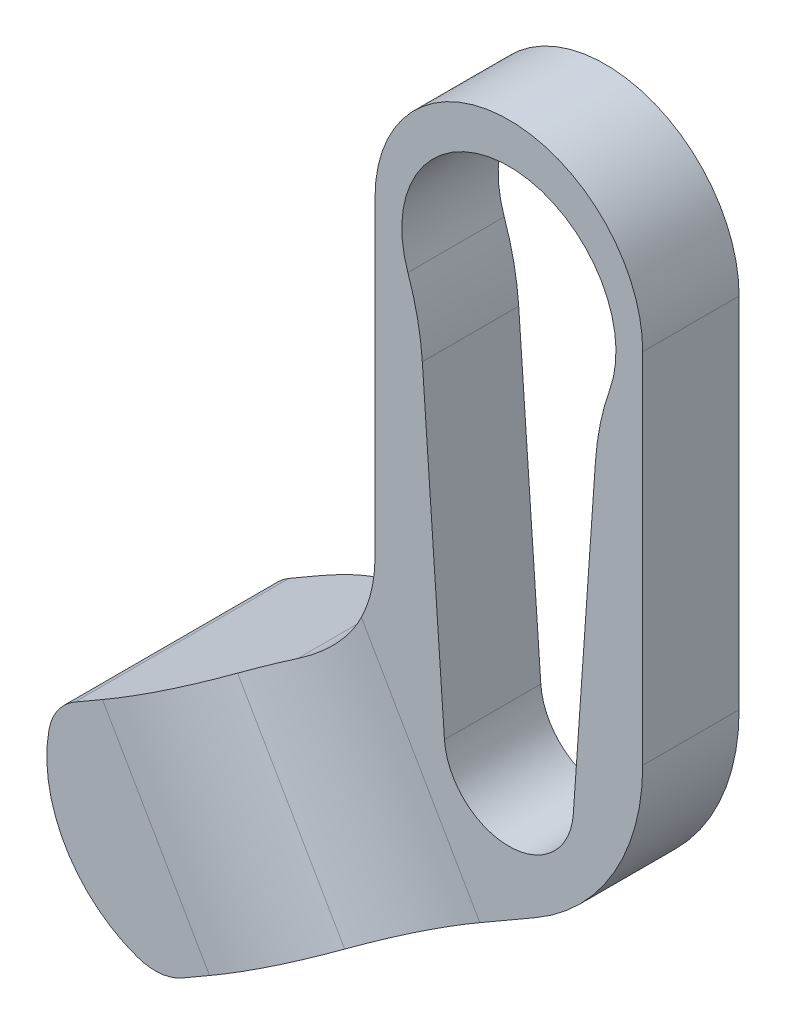
ISO-10303-21;
HEADER;
FILE_DESCRIPTION(('STEP AP214'),'2;1');
FILE_NAME('part.step','',(''),(''),'','','');
FILE_SCHEMA(('AUTOMOTIVE_DESIGN { 1 0 10303 214 1 1 1 1 }'));
ENDSEC;
DATA;
#1=APPLICATION_CONTEXT('core data for automotive mechanical design processes');
#2=APPLICATION_PROTOCOL_DEFINITION('international standard','automotive_design',2000,#1);
#3=PRODUCT_CONTEXT('',#1,'mechanical');
#4=PRODUCT('Part','Part','',(#3));
#5=PRODUCT_RELATED_PRODUCT_CATEGORY('part','',(#4));
#6=PRODUCT_DEFINITION_FORMATION('','',#4);
#7=PRODUCT_DEFINITION_CONTEXT('part definition',#1,'design');
#8=PRODUCT_DEFINITION('design','',#6,#7);
#9=PRODUCT_DEFINITION_SHAPE('','',#8);
#10=(LENGTH_UNIT() NAMED_UNIT(*) SI_UNIT(.MILLI.,.METRE.));
#11=(NAMED_UNIT(*) PLANE_ANGLE_UNIT() SI_UNIT($,.RADIAN.));
#12=(NAMED_UNIT(*) SI_UNIT($,.STERADIAN.) SOLID_ANGLE_UNIT());
#13=UNCERTAINTY_MEASURE_WITH_UNIT(LENGTH_MEASURE(1.E-05),#10,'distance_accuracy_value','');
#14=(GEOMETRIC_REPRESENTATION_CONTEXT(3) GLOBAL_UNCERTAINTY_ASSIGNED_CONTEXT((#13)) GLOBAL_UNIT_ASSIGNED_CONTEXT((#10,
#11,#12)) REPRESENTATION_CONTEXT('',''));
#15=CARTESIAN_POINT('',(0.,0.,0.));
#16=DIRECTION('',(0.,0.,1.));
#17=DIRECTION('',(1.,0.,0.));
#18=AXIS2_PLACEMENT_3D('',#15,#16,#17);
#19=CARTESIAN_POINT('',(-18.7542685333123,32.483345958487,4.));
#20=DIRECTION('',(0.500000000000002,-0.866025403784438,0.));
#21=DIRECTION('',(0.866025403784437,0.500000000000002,0.));
#22=AXIS2_PLACEMENT_3D('',#19,#20,#21);
#23=PLANE('',#22);
#24=DIRECTION('',(-0.866025403784437,-0.500000000000002,0.));
#25=VECTOR('',#24,1.);
#26=CARTESIAN_POINT('',(-18.7542685333123,32.483345958487,-4.));
#27=LINE('',#26,#25);
#28=CARTESIAN_POINT('',(-40.1409501060127,20.1357395954156,-4.));
#29=VERTEX_POINT('',#28);
#30=CARTESIAN_POINT('',(-41.1701576054595,19.541526368558,-4.));
#31=VERTEX_POINT('',#30);
#32=EDGE_CURVE('E435',#29,#31,#27,.T.);
#33=ORIENTED_EDGE('',*,*,#32,.F.);
#34=CARTESIAN_POINT('',(-40.1409501060127,20.1357395954156,6.));
#35=DIRECTION('',(0.500000000000002,-0.866025403784438,0.));
#36=DIRECTION('',(0.866025403784437,0.500000000000002,0.));
#37=AXIS2_PLACEMENT_3D('',#34,#35,#36);
#38=CIRCLE('',#37,10.);
#39=CARTESIAN_POINT('',(-36.1922161316863,22.4155422184512,-2.9));
#40=VERTEX_POINT('',#39);
#41=EDGE_CURVE('E255',#29,#40,#38,.T.);
#42=ORIENTED_EDGE('',*,*,#41,.T.);
#43=CARTESIAN_POINT('',(-32.2434821573598,24.6953448414868,-11.8));
#44=DIRECTION('',(0.500000000000002,-0.866025403784438,0.));
#45=DIRECTION('',(0.866025403784437,0.500000000000002,0.));
#46=AXIS2_PLACEMENT_3D('',#43,#44,#45);
#47=CIRCLE('',#46,10.);
#48=CARTESIAN_POINT('',(-32.2434821573598,24.6953448414868,-1.8));
#49=VERTEX_POINT('',#48);
#50=EDGE_CURVE('E271',#40,#49,#47,.F.);
#51=ORIENTED_EDGE('',*,*,#50,.T.);
#52=DIRECTION('',(0.866025403784437,0.500000000000002,0.));
#53=VECTOR('',#52,1.);
#54=CARTESIAN_POINT('',(-18.7542685333123,32.483345958487,-1.8));
#55=LINE('',#54,#53);
#56=CARTESIAN_POINT('',(-30.1595216539752,25.8985199990964,-1.8));
#57=VERTEX_POINT('',#56);
#58=EDGE_CURVE('E409',#49,#57,#55,.T.);
#59=ORIENTED_EDGE('',*,*,#58,.T.);
#60=DIRECTION('',(0.,0.,-1.));
#61=VECTOR('',#60,1.);
#62=CARTESIAN_POINT('',(-30.1595216539752,25.8985199990964,4.));
#63=LINE('',#62,#61);
#64=CARTESIAN_POINT('',(-30.1595216539752,25.8985199990964,1.8));
#65=VERTEX_POINT('',#64);
#66=EDGE_CURVE('E359',#57,#65,#63,.F.);
#67=ORIENTED_EDGE('',*,*,#66,.T.);
#68=DIRECTION('',(0.866025403784437,0.500000000000002,0.));
#69=VECTOR('',#68,1.);
#70=CARTESIAN_POINT('',(-18.7542685333123,32.483345958487,1.8));
#71=LINE('',#70,#69);
#72=CARTESIAN_POINT('',(-32.2434821573598,24.6953448414868,1.8));
#73=VERTEX_POINT('',#72);
#74=EDGE_CURVE('E474',#73,#65,#71,.T.);
#75=ORIENTED_EDGE('',*,*,#74,.F.);
#76=CARTESIAN_POINT('',(-32.2434821573598,24.6953448414868,11.8));
#77=DIRECTION('',(0.500000000000002,-0.866025403784438,0.));
#78=DIRECTION('',(0.866025403784437,0.500000000000002,0.));
#79=AXIS2_PLACEMENT_3D('',#76,#77,#78);
#80=CIRCLE('',#79,10.);
#81=CARTESIAN_POINT('',(-36.1922161316863,22.4155422184512,2.9));
#82=VERTEX_POINT('',#81);
#83=EDGE_CURVE('E509',#73,#82,#80,.F.);
#84=ORIENTED_EDGE('',*,*,#83,.T.);
#85=CARTESIAN_POINT('',(-40.1409501060127,20.1357395954156,-6.));
#86=DIRECTION('',(0.500000000000002,-0.866025403784438,0.));
#87=DIRECTION('',(0.866025403784437,0.500000000000002,0.));
#88=AXIS2_PLACEMENT_3D('',#85,#86,#87);
#89=CIRCLE('',#88,10.);
#90=CARTESIAN_POINT('',(-40.1409501060127,20.1357395954156,4.));
#91=VERTEX_POINT('',#90);
#92=EDGE_CURVE('E253',#82,#91,#89,.T.);
#93=ORIENTED_EDGE('',*,*,#92,.T.);
#94=DIRECTION('',(-0.866025403784437,-0.500000000000002,0.));
#95=VECTOR('',#94,1.);
#96=CARTESIAN_POINT('',(-18.7542685333123,32.483345958487,4.));
#97=LINE('',#96,#95);
#98=CARTESIAN_POINT('',(-41.1701576054595,19.541526368558,4.));
#99=VERTEX_POINT('',#98);
#100=EDGE_CURVE('E421',#91,#99,#97,.T.);
#101=ORIENTED_EDGE('',*,*,#100,.T.);
#102=DIRECTION('',(0.,0.,-1.));
#103=VECTOR('',#102,1.);
#104=CARTESIAN_POINT('',(-41.1701576054595,19.541526368558,4.));
#105=LINE('',#104,#103);
#106=EDGE_CURVE('E447',#99,#31,#105,.T.);
#107=ORIENTED_EDGE('',*,*,#106,.T.);
#108=EDGE_LOOP('',(#33,#42,#51,#59,#67,#75,#84,#93,#101,#107));
#109=FACE_BOUND('',#108,.T.);
#110=ADVANCED_FACE('F64',(#109),#23,.T.);
#111=CARTESIAN_POINT('',(-26.1595216539752,0.,4.));
#112=DIRECTION('',(1.,0.,0.));
#113=DIRECTION('',(0.,1.,0.));
#114=AXIS2_PLACEMENT_3D('',#111,#112,#113);
#115=PLANE('',#114);
#116=DIRECTION('',(0.,0.,-1.));
#117=VECTOR('',#116,1.);
#118=CARTESIAN_POINT('',(-26.1595216539752,32.8267232293719,4.));
#119=LINE('',#118,#117);
#120=CARTESIAN_POINT('',(-26.1595216539752,32.8267232293719,1.8));
#121=VERTEX_POINT('',#120);
#122=CARTESIAN_POINT('',(-26.1595216539752,32.8267232293719,-1.8));
#123=VERTEX_POINT('',#122);
#124=EDGE_CURVE('E366',#121,#123,#119,.T.);
#125=ORIENTED_EDGE('',*,*,#124,.T.);
#126=DIRECTION('',(0.,1.,0.));
#127=VECTOR('',#126,1.);
#128=CARTESIAN_POINT('',(-26.1595216539752,0.,-1.80000000000001));
#129=LINE('',#128,#127);
#130=CARTESIAN_POINT('',(-26.1595216539752,46.2079210758549,-1.8));
#131=VERTEX_POINT('',#130);
#132=EDGE_CURVE('E405',#123,#131,#129,.T.);
#133=ORIENTED_EDGE('',*,*,#132,.T.);
#134=DIRECTION('',(0.,0.,-1.));
#135=VECTOR('',#134,1.);
#136=CARTESIAN_POINT('',(-26.1595216539752,46.2079210758549,4.));
#137=LINE('',#136,#135);
#138=CARTESIAN_POINT('',(-26.1595216539752,46.2079210758549,1.8));
#139=VERTEX_POINT('',#138);
#140=EDGE_CURVE('E444',#139,#131,#137,.T.);
#141=ORIENTED_EDGE('',*,*,#140,.F.);
#142=DIRECTION('',(0.,1.,0.));
#143=VECTOR('',#142,1.);
#144=CARTESIAN_POINT('',(-26.1595216539752,0.,1.79999999999999));
#145=LINE('',#144,#143);
#146=EDGE_CURVE('E471',#121,#139,#145,.T.);
#147=ORIENTED_EDGE('',*,*,#146,.F.);
#148=EDGE_LOOP('',(#125,#133,#141,#147));
#149=FACE_BOUND('',#148,.T.);
#150=ADVANCED_FACE('F315',(#149),#115,.T.);
#151=CARTESIAN_POINT('',(-31.1595216539752,46.2079210758549,4.));
#152=DIRECTION('',(0.,0.,-1.));
#153=DIRECTION('',(-1.,0.,0.));
#154=AXIS2_PLACEMENT_3D('',#151,#152,#153);
#155=CYLINDRICAL_SURFACE('',#154,5.);
#156=ORIENTED_EDGE('',*,*,#140,.T.);
#157=CARTESIAN_POINT('',(-31.1595216539752,46.2079210758549,-1.8));
#158=DIRECTION('',(0.,0.,-1.));
#159=DIRECTION('',(0.,1.,0.));
#160=AXIS2_PLACEMENT_3D('',#157,#158,#159);
#161=CIRCLE('',#160,5.);
#162=CARTESIAN_POINT('',(-36.1595216539752,46.2079210758549,-1.8));
#163=VERTEX_POINT('',#162);
#164=EDGE_CURVE('E402',#131,#163,#161,.F.);
#165=ORIENTED_EDGE('',*,*,#164,.T.);
#166=DIRECTION('',(0.,0.,-1.));
#167=VECTOR('',#166,1.);
#168=CARTESIAN_POINT('',(-36.1595216539752,46.2079210758549,4.));
#169=LINE('',#168,#167);
#170=CARTESIAN_POINT('',(-36.1595216539752,46.2079210758549,1.8));
#171=VERTEX_POINT('',#170);
#172=EDGE_CURVE('E441',#171,#163,#169,.T.);
#173=ORIENTED_EDGE('',*,*,#172,.F.);
#174=CARTESIAN_POINT('',(-31.1595216539752,46.2079210758549,1.8));
#175=DIRECTION('',(0.,0.,-1.));
#176=DIRECTION('',(0.,1.,0.));
#177=AXIS2_PLACEMENT_3D('',#174,#175,#176);
#178=CIRCLE('',#177,5.);
#179=EDGE_CURVE('E469',#139,#171,#178,.F.);
#180=ORIENTED_EDGE('',*,*,#179,.F.);
#181=EDGE_LOOP('',(#156,#165,#173,#180));
#182=FACE_BOUND('',#181,.T.);
#183=ADVANCED_FACE('F321',(#182),#155,.T.);
#184=CARTESIAN_POINT('',(-36.1595216539752,0.,4.));
#185=DIRECTION('',(-1.,0.,0.));
#186=DIRECTION('',(0.,0.,1.));
#187=AXIS2_PLACEMENT_3D('',#184,#185,#186);
#188=PLANE('',#187);
#189=ORIENTED_EDGE('',*,*,#172,.T.);
#190=DIRECTION('',(0.,-1.,0.));
#191=VECTOR('',#190,1.);
#192=CARTESIAN_POINT('',(-36.1595216539752,0.,-1.80000000000001));
#193=LINE('',#192,#191);
#194=CARTESIAN_POINT('',(-36.1595216539752,34.5587740369408,-1.8));
#195=VERTEX_POINT('',#194);
#196=EDGE_CURVE('E399',#163,#195,#193,.T.);
#197=ORIENTED_EDGE('',*,*,#196,.T.);
#198=DIRECTION('',(0.,0.,-1.));
#199=VECTOR('',#198,1.);
#200=CARTESIAN_POINT('',(-36.1595216539752,34.5587740369408,4.));
#201=LINE('',#200,#199);
#202=CARTESIAN_POINT('',(-36.1595216539752,34.5587740369408,1.8));
#203=VERTEX_POINT('',#202);
#204=EDGE_CURVE('E368',#195,#203,#201,.F.);
#205=ORIENTED_EDGE('',*,*,#204,.T.);
#206=DIRECTION('',(0.,-1.,0.));
#207=VECTOR('',#206,1.);
#208=CARTESIAN_POINT('',(-36.1595216539752,0.,1.79999999999999));
#209=LINE('',#208,#207);
#210=EDGE_CURVE('E466',#171,#203,#209,.T.);
#211=ORIENTED_EDGE('',*,*,#210,.F.);
#212=EDGE_LOOP('',(#189,#197,#205,#211));
#213=FACE_BOUND('',#212,.T.);
#214=ADVANCED_FACE('F491',(#213),#188,.T.);
#215=CARTESIAN_POINT('',(-22.7542685333121,39.4115491887625,4.));
#216=DIRECTION('',(-0.499999999999997,0.86602540378444,0.));
#217=DIRECTION('',(-0.86602540378444,-0.499999999999997,0.));
#218=AXIS2_PLACEMENT_3D('',#215,#216,#217);
#219=PLANE('',#218);
#220=DIRECTION('',(0.,0.,-1.));
#221=VECTOR('',#220,1.);
#222=CARTESIAN_POINT('',(-38.6595216539753,30.2286470180186,-4.));
#223=LINE('',#222,#221);
#224=CARTESIAN_POINT('',(-38.6595216539753,30.2286470180186,2.19703149015583));
#225=VERTEX_POINT('',#224);
#226=CARTESIAN_POINT('',(-38.6595216539753,30.2286470180186,-2.19703149015583));
#227=VERTEX_POINT('',#226);
#228=EDGE_CURVE('E84',#225,#227,#223,.T.);
#229=ORIENTED_EDGE('',*,*,#228,.T.);
#230=CARTESIAN_POINT('',(-36.2434821573598,31.6235480717623,-11.8));
#231=DIRECTION('',(-0.499999999999997,0.86602540378444,0.));
#232=DIRECTION('',(-0.86602540378444,-0.499999999999997,0.));
#233=AXIS2_PLACEMENT_3D('',#230,#231,#232);
#234=CIRCLE('',#233,10.);
#235=CARTESIAN_POINT('',(-40.1922161316862,29.3437454487267,-2.9));
#236=VERTEX_POINT('',#235);
#237=EDGE_CURVE('E279',#227,#236,#234,.F.);
#238=ORIENTED_EDGE('',*,*,#237,.T.);
#239=CARTESIAN_POINT('',(-44.1409501060127,27.0639428256911,6.));
#240=DIRECTION('',(-0.499999999999997,0.86602540378444,0.));
#241=DIRECTION('',(-0.86602540378444,-0.499999999999997,0.));
#242=AXIS2_PLACEMENT_3D('',#239,#240,#241);
#243=CIRCLE('',#242,10.);
#244=CARTESIAN_POINT('',(-44.1409501060127,27.0639428256911,-4.));
#245=VERTEX_POINT('',#244);
#246=EDGE_CURVE('E249',#236,#245,#243,.T.);
#247=ORIENTED_EDGE('',*,*,#246,.T.);
#248=DIRECTION('',(0.86602540378444,0.499999999999997,0.));
#249=VECTOR('',#248,1.);
#250=CARTESIAN_POINT('',(-22.7542685333121,39.4115491887625,-4.));
#251=LINE('',#250,#249);
#252=CARTESIAN_POINT('',(-45.1701576054596,26.4697295988335,-4.));
#253=VERTEX_POINT('',#252);
#254=EDGE_CURVE('E416',#253,#245,#251,.T.);
#255=ORIENTED_EDGE('',*,*,#254,.F.);
#256=DIRECTION('',(0.,0.,-1.));
#257=VECTOR('',#256,1.);
#258=CARTESIAN_POINT('',(-45.1701576054596,26.4697295988335,4.));
#259=LINE('',#258,#257);
#260=CARTESIAN_POINT('',(-45.1701576054596,26.4697295988335,4.));
#261=VERTEX_POINT('',#260);
#262=EDGE_CURVE('E439',#261,#253,#259,.T.);
#263=ORIENTED_EDGE('',*,*,#262,.F.);
#264=DIRECTION('',(0.86602540378444,0.499999999999997,0.));
#265=VECTOR('',#264,1.);
#266=CARTESIAN_POINT('',(-22.7542685333121,39.4115491887625,4.));
#267=LINE('',#266,#265);
#268=CARTESIAN_POINT('',(-44.1409501060127,27.0639428256911,4.));
#269=VERTEX_POINT('',#268);
#270=EDGE_CURVE('E423',#261,#269,#267,.T.);
#271=ORIENTED_EDGE('',*,*,#270,.T.);
#272=CARTESIAN_POINT('',(-44.1409501060127,27.0639428256911,-6.));
#273=DIRECTION('',(-0.499999999999997,0.86602540378444,0.));
#274=DIRECTION('',(-0.86602540378444,-0.499999999999997,0.));
#275=AXIS2_PLACEMENT_3D('',#272,#273,#274);
#276=CIRCLE('',#275,10.);
#277=CARTESIAN_POINT('',(-40.1922161316862,29.3437454487267,2.9));
#278=VERTEX_POINT('',#277);
#279=EDGE_CURVE('E246',#269,#278,#276,.T.);
#280=ORIENTED_EDGE('',*,*,#279,.T.);
#281=CARTESIAN_POINT('',(-36.2434821573598,31.6235480717623,11.8));
#282=DIRECTION('',(-0.499999999999997,0.86602540378444,0.));
#283=DIRECTION('',(-0.86602540378444,-0.499999999999997,0.));
#284=AXIS2_PLACEMENT_3D('',#281,#282,#283);
#285=CIRCLE('',#284,10.);
#286=EDGE_CURVE('E78',#278,#225,#285,.F.);
#287=ORIENTED_EDGE('',*,*,#286,.T.);
#288=EDGE_LOOP('',(#229,#238,#247,#255,#263,#271,#280,#287));
#289=FACE_BOUND('',#288,.T.);
#290=ADVANCED_FACE('F486',(#289),#219,.T.);
#291=CARTESIAN_POINT('',(0.,0.,4.));
#292=DIRECTION('',(0.,0.,1.));
#293=DIRECTION('',(1.,0.,0.));
#294=AXIS2_PLACEMENT_3D('',#291,#292,#293);
#295=PLANE('',#294);
#296=ORIENTED_EDGE('',*,*,#100,.F.);
#297=DIRECTION('',(0.499999999999998,-0.86602540378444,0.));
#298=VECTOR('',#297,1.);
#299=CARTESIAN_POINT('',(-44.1409501060127,27.0639428256911,4.));
#300=LINE('',#299,#298);
#301=EDGE_CURVE('E258',#91,#269,#300,.F.);
#302=ORIENTED_EDGE('',*,*,#301,.T.);
#303=ORIENTED_EDGE('',*,*,#270,.F.);
#304=CARTESIAN_POINT('',(-44.1701576054596,24.7376787912646,4.));
#305=DIRECTION('',(0.,0.,1.));
#306=DIRECTION('',(1.,0.,0.));
#307=AXIS2_PLACEMENT_3D('',#304,#305,#306);
#308=CIRCLE('',#307,2.00000000000002);
#309=CARTESIAN_POINT('',(-46.1377451549108,25.0962861465219,4.));
#310=VERTEX_POINT('',#309);
#311=EDGE_CURVE('E412',#261,#310,#308,.T.);
#312=ORIENTED_EDGE('',*,*,#311,.T.);
#313=CARTESIAN_POINT('',(-41.129902450446,24.1835698466584,4.));
#314=DIRECTION('',(0.,0.,1.));
#315=DIRECTION('',(1.,0.,0.));
#316=AXIS2_PLACEMENT_3D('',#313,#314,#315);
#317=CIRCLE('',#316,5.09033786665463);
#318=CARTESIAN_POINT('',(-42.8433883005482,19.3902926965034,4.));
#319=VERTEX_POINT('',#318);
#320=EDGE_CURVE('E415',#310,#319,#317,.T.);
#321=ORIENTED_EDGE('',*,*,#320,.T.);
#322=CARTESIAN_POINT('',(-42.1701576054595,21.2735771761268,4.));
#323=DIRECTION('',(0.,0.,1.));
#324=DIRECTION('',(1.,0.,0.));
#325=AXIS2_PLACEMENT_3D('',#322,#323,#324);
#326=CIRCLE('',#325,2.);
#327=EDGE_CURVE('E418',#99,#319,#326,.F.);
#328=ORIENTED_EDGE('',*,*,#327,.F.);
#329=EDGE_LOOP('',(#296,#302,#303,#312,#321,#328));
#330=FACE_BOUND('',#329,.T.);
#331=ADVANCED_FACE('F352',(#330),#295,.T.);
#332=CARTESIAN_POINT('',(0.,0.,-4.));
#333=DIRECTION('',(0.,0.,1.));
#334=DIRECTION('',(1.,0.,0.));
#335=AXIS2_PLACEMENT_3D('',#332,#333,#334);
#336=PLANE('',#335);
#337=ORIENTED_EDGE('',*,*,#254,.T.);
#338=DIRECTION('',(-0.499999999999998,0.86602540378444,0.));
#339=VECTOR('',#338,1.);
#340=CARTESIAN_POINT('',(-21.3866815727006,-12.3476063630714,-4.));
#341=LINE('',#340,#339);
#342=EDGE_CURVE('E251',#245,#29,#341,.F.);
#343=ORIENTED_EDGE('',*,*,#342,.T.);
#344=ORIENTED_EDGE('',*,*,#32,.T.);
#345=CARTESIAN_POINT('',(-42.1701576054595,21.2735771761268,-4.));
#346=DIRECTION('',(0.,0.,1.));
#347=DIRECTION('',(1.,0.,0.));
#348=AXIS2_PLACEMENT_3D('',#345,#346,#347);
#349=CIRCLE('',#348,2.);
#350=CARTESIAN_POINT('',(-42.8433883005482,19.3902926965034,-4.));
#351=VERTEX_POINT('',#350);
#352=EDGE_CURVE('E432',#31,#351,#349,.F.);
#353=ORIENTED_EDGE('',*,*,#352,.T.);
#354=CARTESIAN_POINT('',(-41.129902450446,24.1835698466584,-4.));
#355=DIRECTION('',(0.,0.,1.));
#356=DIRECTION('',(1.,0.,0.));
#357=AXIS2_PLACEMENT_3D('',#354,#355,#356);
#358=CIRCLE('',#357,5.09033786665463);
#359=CARTESIAN_POINT('',(-46.1377451549108,25.0962861465219,-4.));
#360=VERTEX_POINT('',#359);
#361=EDGE_CURVE('E429',#360,#351,#358,.T.);
#362=ORIENTED_EDGE('',*,*,#361,.F.);
#363=CARTESIAN_POINT('',(-44.1701576054596,24.7376787912646,-4.));
#364=DIRECTION('',(0.,0.,1.));
#365=DIRECTION('',(1.,0.,0.));
#366=AXIS2_PLACEMENT_3D('',#363,#364,#365);
#367=CIRCLE('',#366,2.00000000000002);
#368=EDGE_CURVE('E411',#253,#360,#367,.T.);
#369=ORIENTED_EDGE('',*,*,#368,.F.);
#370=EDGE_LOOP('',(#337,#343,#344,#353,#362,#369));
#371=FACE_BOUND('',#370,.T.);
#372=ADVANCED_FACE('F346',(#371),#336,.F.);
#373=CARTESIAN_POINT('',(-34.1595216539752,32.8267232293719,4.));
#374=DIRECTION('',(0.,0.,-1.));
#375=DIRECTION('',(-1.,0.,0.));
#376=AXIS2_PLACEMENT_3D('',#373,#374,#375);
#377=CYLINDRICAL_SURFACE('',#376,8.);
#378=ORIENTED_EDGE('',*,*,#66,.F.);
#379=CARTESIAN_POINT('',(-34.1595216539752,32.8267232293719,-1.8));
#380=DIRECTION('',(0.,0.,-1.));
#381=DIRECTION('',(0.,1.,0.));
#382=AXIS2_PLACEMENT_3D('',#379,#380,#381);
#383=CIRCLE('',#382,8.);
#384=EDGE_CURVE('E362',#57,#123,#383,.F.);
#385=ORIENTED_EDGE('',*,*,#384,.T.);
#386=ORIENTED_EDGE('',*,*,#124,.F.);
#387=CARTESIAN_POINT('',(-34.1595216539752,32.8267232293719,1.8));
#388=DIRECTION('',(0.,0.,-1.));
#389=DIRECTION('',(0.,1.,0.));
#390=AXIS2_PLACEMENT_3D('',#387,#388,#389);
#391=CIRCLE('',#390,8.);
#392=EDGE_CURVE('E364',#65,#121,#391,.F.);
#393=ORIENTED_EDGE('',*,*,#392,.F.);
#394=EDGE_LOOP('',(#378,#385,#386,#393));
#395=FACE_BOUND('',#394,.T.);
#396=ADVANCED_FACE('F344',(#395),#377,.T.);
#397=CARTESIAN_POINT('',(-41.1595216539752,34.5587740369408,4.));
#398=DIRECTION('',(0.,0.,1.));
#399=DIRECTION('',(1.,0.,0.));
#400=AXIS2_PLACEMENT_3D('',#397,#398,#399);
#401=CYLINDRICAL_SURFACE('',#400,5.);
#402=CARTESIAN_POINT('',(-41.1595216539752,34.5587740369408,-1.8));
#403=DIRECTION('',(0.,0.,-1.));
#404=DIRECTION('',(0.,1.,0.));
#405=AXIS2_PLACEMENT_3D('',#402,#403,#404);
#406=CIRCLE('',#405,5.);
#407=CARTESIAN_POINT('',(-36.6688132560011,32.3602431446482,-1.8));
#408=VERTEX_POINT('',#407);
#409=EDGE_CURVE('E397',#408,#195,#406,.F.);
#410=ORIENTED_EDGE('',*,*,#409,.F.);
#411=CARTESIAN_POINT('',(-36.6688132560011,32.3602431446482,-1.8));
#412=CARTESIAN_POINT('',(-36.7264331572822,32.2425030222988,-1.79998572842934));
#413=CARTESIAN_POINT('',(-36.7887247067042,32.127034024346,-1.80177392782699));
#414=CARTESIAN_POINT('',(-36.9221194003373,31.9014172242155,-1.80942604325308));
#415=CARTESIAN_POINT('',(-36.9932242136198,31.7912704354735,-1.81529073226634));
#416=CARTESIAN_POINT('',(-37.141664089983,31.5800076722589,-1.83134766036201));
#417=CARTESIAN_POINT('',(-37.2187796273912,31.4787283243523,-1.84141902312098));
#418=CARTESIAN_POINT('',(-37.3801858999477,31.2826889245643,-1.86618826545921));
#419=CARTESIAN_POINT('',(-37.4644752145761,31.1879275887035,-1.88088523064478));
#420=CARTESIAN_POINT('',(-37.6335390294554,31.0117585786537,-1.91395948534467));
#421=CARTESIAN_POINT('',(-37.7178872180868,30.9298809014999,-1.9320168617516));
#422=CARTESIAN_POINT('',(-37.8915656855958,30.7727230318342,-1.97243442176032));
#423=CARTESIAN_POINT('',(-37.9808963519556,30.6974433536156,-1.99479494034535));
#424=CARTESIAN_POINT('',(-38.1662154092498,30.551987442583,-2.04446195553741));
#425=CARTESIAN_POINT('',(-38.2623160802781,30.4819928688361,-2.07188112410829));
#426=CARTESIAN_POINT('',(-38.4582813288554,30.3495788888432,-2.13115485297687));
#427=CARTESIAN_POINT('',(-38.5581455230241,30.2871587137319,-2.16300896238473));
#428=CARTESIAN_POINT('',(-38.6595216539753,30.2286470180186,-2.19703149015584));
#429=B_SPLINE_CURVE_WITH_KNOTS('',3,(#411,#412,#413,#414,#415,#416,#417,#418,#419,#420,#421,
#422,#423,#424,#425,#426,#427,#428),.UNSPECIFIED.,.F.,.F.,(4,2,2,2,2,2,2,2,4),(0.,
0.393157169916534,0.786388910722232,1.16902396129342,1.55158341964692,1.90801492589922,
2.26447419021904,2.63012538392333,2.99573942985423),.UNSPECIFIED.);
#430=EDGE_CURVE('E273',#408,#227,#429,.T.);
#431=ORIENTED_EDGE('',*,*,#430,.T.);
#432=ORIENTED_EDGE('',*,*,#228,.F.);
#433=CARTESIAN_POINT('',(-38.6595216539753,30.2286470180186,2.19703149015583));
#434=CARTESIAN_POINT('',(-38.5504813540293,30.2915770615295,2.16043269385625));
#435=CARTESIAN_POINT('',(-38.4431897348049,30.3590363461537,2.12634802201448));
#436=CARTESIAN_POINT('',(-38.2330168777514,30.502702014925,2.0633158407473));
#437=CARTESIAN_POINT('',(-38.130136481699,30.5789100584505,2.03436930853338));
#438=CARTESIAN_POINT('',(-37.9324401795684,30.737571657978,1.98244518147372));
#439=CARTESIAN_POINT('',(-37.8374816924546,30.8198016897547,1.95932780836726));
#440=CARTESIAN_POINT('',(-37.6534908295919,30.9917591581852,1.91804185283689));
#441=CARTESIAN_POINT('',(-37.5644572946523,31.0814851204997,1.89987230023007));
#442=CARTESIAN_POINT('',(-37.3989685249038,31.2614805552679,1.86941942165692));
#443=CARTESIAN_POINT('',(-37.3220693608275,31.3512888061618,1.85681736030877));
#444=CARTESIAN_POINT('',(-37.1746208210043,31.5364284858557,1.83557168955253));
#445=CARTESIAN_POINT('',(-37.1040719252866,31.6317603313013,1.82692837919262));
#446=CARTESIAN_POINT('',(-36.9680950055578,31.8299024104099,1.81315154674262));
#447=CARTESIAN_POINT('',(-36.9028459874477,31.9328421085382,1.80811429767117));
#448=CARTESIAN_POINT('',(-36.7799920386354,32.1432817298557,1.80153350018811));
#449=CARTESIAN_POINT('',(-36.7223863924707,32.2507812249775,1.79998962455963));
#450=CARTESIAN_POINT('',(-36.6688132560011,32.3602431446482,1.8));
#451=B_SPLINE_CURVE_WITH_KNOTS('',3,(#433,#434,#435,#436,#437,#438,#439,#440,#441,#442,#443,
#444,#445,#446,#447,#448,#449,#450),.UNSPECIFIED.,.F.,.F.,(4,2,2,2,2,2,2,2,4),(0.,
0.39324104493422,0.786556799571487,1.16927810603796,1.55192431328124,1.90827072818749,
2.26464405743487,2.63020885892725,2.99573941732296),.UNSPECIFIED.);
#452=CARTESIAN_POINT('',(-36.6688132560011,32.3602431446482,1.8));
#453=VERTEX_POINT('',#452);
#454=EDGE_CURVE('E13',#225,#453,#451,.T.);
#455=ORIENTED_EDGE('',*,*,#454,.T.);
#456=CARTESIAN_POINT('',(-41.1595216539752,34.5587740369408,1.8));
#457=DIRECTION('',(0.,0.,-1.));
#458=DIRECTION('',(0.,1.,0.));
#459=AXIS2_PLACEMENT_3D('',#456,#457,#458);
#460=CIRCLE('',#459,5.);
#461=EDGE_CURVE('E460',#453,#203,#460,.F.);
#462=ORIENTED_EDGE('',*,*,#461,.T.);
#463=ORIENTED_EDGE('',*,*,#204,.F.);
#464=EDGE_LOOP('',(#410,#431,#432,#455,#462,#463));
#465=FACE_BOUND('',#464,.T.);
#466=ADVANCED_FACE('F281',(#465),#401,.F.);
#467=CARTESIAN_POINT('',(-44.1701576054596,24.7376787912646,4.));
#468=DIRECTION('',(0.,0.,-1.));
#469=DIRECTION('',(-1.,0.,0.));
#470=AXIS2_PLACEMENT_3D('',#467,#468,#469);
#471=CYLINDRICAL_SURFACE('',#470,2.00000000000002);
#472=ORIENTED_EDGE('',*,*,#368,.T.);
#473=DIRECTION('',(0.,0.,-1.));
#474=VECTOR('',#473,1.);
#475=CARTESIAN_POINT('',(-46.1377451549108,25.0962861465219,4.));
#476=LINE('',#475,#474);
#477=EDGE_CURVE('E370',#310,#360,#476,.T.);
#478=ORIENTED_EDGE('',*,*,#477,.F.);
#479=ORIENTED_EDGE('',*,*,#311,.F.);
#480=ORIENTED_EDGE('',*,*,#262,.T.);
#481=EDGE_LOOP('',(#472,#478,#479,#480));
#482=FACE_BOUND('',#481,.T.);
#483=ADVANCED_FACE('F334',(#482),#471,.T.);
#484=CARTESIAN_POINT('',(-41.129902450446,24.1835698466584,4.));
#485=DIRECTION('',(0.,0.,-1.));
#486=DIRECTION('',(-1.,0.,0.));
#487=AXIS2_PLACEMENT_3D('',#484,#485,#486);
#488=CYLINDRICAL_SURFACE('',#487,5.09033786665463);
#489=ORIENTED_EDGE('',*,*,#361,.T.);
#490=DIRECTION('',(0.,0.,-1.));
#491=VECTOR('',#490,1.);
#492=CARTESIAN_POINT('',(-42.8433883005482,19.3902926965034,4.));
#493=LINE('',#492,#491);
#494=EDGE_CURVE('E450',#319,#351,#493,.T.);
#495=ORIENTED_EDGE('',*,*,#494,.F.);
#496=ORIENTED_EDGE('',*,*,#320,.F.);
#497=ORIENTED_EDGE('',*,*,#477,.T.);
#498=EDGE_LOOP('',(#489,#495,#496,#497));
#499=FACE_BOUND('',#498,.T.);
#500=ADVANCED_FACE('F330',(#499),#488,.T.);
#501=CARTESIAN_POINT('',(-42.1701576054595,21.2735771761268,4.));
#502=DIRECTION('',(0.,0.,-1.));
#503=DIRECTION('',(-1.,0.,0.));
#504=AXIS2_PLACEMENT_3D('',#501,#502,#503);
#505=CYLINDRICAL_SURFACE('',#504,2.);
#506=ORIENTED_EDGE('',*,*,#352,.F.);
#507=ORIENTED_EDGE('',*,*,#106,.F.);
#508=ORIENTED_EDGE('',*,*,#327,.T.);
#509=ORIENTED_EDGE('',*,*,#494,.T.);
#510=EDGE_LOOP('',(#506,#507,#508,#509));
#511=FACE_BOUND('',#510,.T.);
#512=ADVANCED_FACE('F327',(#511),#505,.T.);
#513=CARTESIAN_POINT('',(-30.9352236109565,59.4796795071526,1.8));
#514=DIRECTION('',(0.,0.,-1.));
#515=DIRECTION('',(0.,1.,0.));
#516=AXIS2_PLACEMENT_3D('',#513,#514,#515);
#517=PLANE('',#516);
#518=ORIENTED_EDGE('',*,*,#461,.F.);
#519=DIRECTION('',(-0.499999999999998,0.86602540378444,0.));
#520=VECTOR('',#519,1.);
#521=CARTESIAN_POINT('',(-46.9784762578621,50.2171032727845,1.8));
#522=LINE('',#521,#520);
#523=EDGE_CURVE('E266',#453,#73,#522,.F.);
#524=ORIENTED_EDGE('',*,*,#523,.T.);
#525=ORIENTED_EDGE('',*,*,#74,.T.);
#526=ORIENTED_EDGE('',*,*,#392,.T.);
#527=ORIENTED_EDGE('',*,*,#146,.T.);
#528=ORIENTED_EDGE('',*,*,#179,.T.);
#529=ORIENTED_EDGE('',*,*,#210,.T.);
#530=EDGE_LOOP('',(#518,#524,#525,#526,#527,#528,#529));
#531=FACE_BOUND('',#530,.T.);
#532=DIRECTION('',(-0.0697564737441263,0.997564050259824,0.));
#533=VECTOR('',#532,1.);
#534=CARTESIAN_POINT('',(-31.3187181112112,-2.19001811167451,1.79999999999999));
#535=LINE('',#534,#533);
#536=CARTESIAN_POINT('',(-33.5663282632942,29.9523045484607,1.8));
#537=VERTEX_POINT('',#536);
#538=CARTESIAN_POINT('',(-34.3923319023615,41.7647069175916,1.8));
#539=VERTEX_POINT('',#538);
#540=EDGE_CURVE('E458',#537,#539,#535,.T.);
#541=ORIENTED_EDGE('',*,*,#540,.T.);
#542=CARTESIAN_POINT('',(-44.3679724049597,41.0671421801503,1.8));
#543=DIRECTION('',(0.,0.,-1.));
#544=DIRECTION('',(0.,1.,0.));
#545=AXIS2_PLACEMENT_3D('',#542,#543,#544);
#546=CIRCLE('',#545,10.);
#547=CARTESIAN_POINT('',(-34.9333647256851,44.3819842485107,1.8));
#548=VERTEX_POINT('',#547);
#549=EDGE_CURVE('E383',#539,#548,#546,.F.);
#550=ORIENTED_EDGE('',*,*,#549,.T.);
#551=CARTESIAN_POINT('',(-31.1595216539752,45.7079210758549,1.8));
#552=DIRECTION('',(0.,0.,-1.));
#553=DIRECTION('',(0.,1.,0.));
#554=AXIS2_PLACEMENT_3D('',#551,#552,#553);
#555=CIRCLE('',#554,4.);
#556=CARTESIAN_POINT('',(-27.3856785822654,44.3819842485107,1.8));
#557=VERTEX_POINT('',#556);
#558=EDGE_CURVE('E220',#548,#557,#555,.T.);
#559=ORIENTED_EDGE('',*,*,#558,.T.);
#560=CARTESIAN_POINT('',(-17.9510709029908,41.0671421801503,1.8));
#561=DIRECTION('',(0.,0.,-1.));
#562=DIRECTION('',(0.,1.,0.));
#563=AXIS2_PLACEMENT_3D('',#560,#561,#562);
#564=CIRCLE('',#563,10.);
#565=CARTESIAN_POINT('',(-27.926711405589,41.7647069175915,1.8));
#566=VERTEX_POINT('',#565);
#567=EDGE_CURVE('E214',#557,#566,#564,.F.);
#568=ORIENTED_EDGE('',*,*,#567,.T.);
#569=DIRECTION('',(0.0697564737441258,0.997564050259824,0.));
#570=VECTOR('',#569,1.);
#571=CARTESIAN_POINT('',(-30.6970828739572,2.14654914134157,1.79999999999999));
#572=LINE('',#571,#570);
#573=CARTESIAN_POINT('',(-28.7527150446563,29.9523045484607,1.8));
#574=VERTEX_POINT('',#573);
#575=EDGE_CURVE('E217',#574,#566,#572,.T.);
#576=ORIENTED_EDGE('',*,*,#575,.F.);
#577=CARTESIAN_POINT('',(-31.1595216539752,30.1206048616149,1.8));
#578=DIRECTION('',(0.,0.,-1.));
#579=DIRECTION('',(0.,1.,0.));
#580=AXIS2_PLACEMENT_3D('',#577,#578,#579);
#581=CIRCLE('',#580,2.41268378575999);
#582=EDGE_CURVE('E456',#574,#537,#581,.T.);
#583=ORIENTED_EDGE('',*,*,#582,.T.);
#584=EDGE_LOOP('',(#541,#550,#559,#568,#576,#583));
#585=FACE_BOUND('',#584,.T.);
#586=ADVANCED_FACE('F216',(#531,#585),#517,.F.);
#587=CARTESIAN_POINT('',(-30.9352236109565,59.4796795071526,-1.8));
#588=DIRECTION('',(0.,0.,-1.));
#589=DIRECTION('',(0.,1.,0.));
#590=AXIS2_PLACEMENT_3D('',#587,#588,#589);
#591=PLANE('',#590);
#592=ORIENTED_EDGE('',*,*,#58,.F.);
#593=DIRECTION('',(0.499999999999998,-0.86602540378444,0.));
#594=VECTOR('',#593,1.);
#595=CARTESIAN_POINT('',(-36.2434821573598,31.6235480717623,-1.8));
#596=LINE('',#595,#594);
#597=EDGE_CURVE('E264',#49,#408,#596,.F.);
#598=ORIENTED_EDGE('',*,*,#597,.T.);
#599=ORIENTED_EDGE('',*,*,#409,.T.);
#600=ORIENTED_EDGE('',*,*,#196,.F.);
#601=ORIENTED_EDGE('',*,*,#164,.F.);
#602=ORIENTED_EDGE('',*,*,#132,.F.);
#603=ORIENTED_EDGE('',*,*,#384,.F.);
#604=EDGE_LOOP('',(#592,#598,#599,#600,#601,#602,#603));
#605=FACE_BOUND('',#604,.T.);
#606=CARTESIAN_POINT('',(-31.1595216539752,30.1206048616149,-1.8));
#607=DIRECTION('',(0.,0.,-1.));
#608=DIRECTION('',(0.,1.,0.));
#609=AXIS2_PLACEMENT_3D('',#606,#607,#608);
#610=CIRCLE('',#609,2.41268378575999);
#611=CARTESIAN_POINT('',(-28.7527150446563,29.9523045484607,-1.8));
#612=VERTEX_POINT('',#611);
#613=CARTESIAN_POINT('',(-33.5663282632942,29.9523045484607,-1.8));
#614=VERTEX_POINT('',#613);
#615=EDGE_CURVE('E387',#612,#614,#610,.T.);
#616=ORIENTED_EDGE('',*,*,#615,.F.);
#617=DIRECTION('',(0.0697564737441258,0.997564050259824,0.));
#618=VECTOR('',#617,1.);
#619=CARTESIAN_POINT('',(-30.6970828739572,2.14654914134157,-1.80000000000001));
#620=LINE('',#619,#618);
#621=CARTESIAN_POINT('',(-27.926711405589,41.7647069175915,-1.8));
#622=VERTEX_POINT('',#621);
#623=EDGE_CURVE('E392',#612,#622,#620,.T.);
#624=ORIENTED_EDGE('',*,*,#623,.T.);
#625=CARTESIAN_POINT('',(-17.9510709029908,41.0671421801503,-1.8));
#626=DIRECTION('',(0.,0.,-1.));
#627=DIRECTION('',(0.,1.,0.));
#628=AXIS2_PLACEMENT_3D('',#625,#626,#627);
#629=CIRCLE('',#628,10.);
#630=CARTESIAN_POINT('',(-27.3856785822654,44.3819842485107,-1.8));
#631=VERTEX_POINT('',#630);
#632=EDGE_CURVE('E225',#631,#622,#629,.F.);
#633=ORIENTED_EDGE('',*,*,#632,.F.);
#634=CARTESIAN_POINT('',(-31.1595216539752,45.7079210758549,-1.8));
#635=DIRECTION('',(0.,0.,-1.));
#636=DIRECTION('',(0.,1.,0.));
#637=AXIS2_PLACEMENT_3D('',#634,#635,#636);
#638=CIRCLE('',#637,4.);
#639=CARTESIAN_POINT('',(-34.9333647256851,44.3819842485107,-1.8));
#640=VERTEX_POINT('',#639);
#641=EDGE_CURVE('E380',#640,#631,#638,.T.);
#642=ORIENTED_EDGE('',*,*,#641,.F.);
#643=CARTESIAN_POINT('',(-44.3679724049597,41.0671421801503,-1.8));
#644=DIRECTION('',(0.,0.,-1.));
#645=DIRECTION('',(0.,1.,0.));
#646=AXIS2_PLACEMENT_3D('',#643,#644,#645);
#647=CIRCLE('',#646,10.);
#648=CARTESIAN_POINT('',(-34.3923319023615,41.7647069175916,-1.8));
#649=VERTEX_POINT('',#648);
#650=EDGE_CURVE('E384',#649,#640,#647,.F.);
#651=ORIENTED_EDGE('',*,*,#650,.F.);
#652=DIRECTION('',(-0.0697564737441263,0.997564050259824,0.));
#653=VECTOR('',#652,1.);
#654=CARTESIAN_POINT('',(-31.3187181112112,-2.19001811167451,-1.80000000000001));
#655=LINE('',#654,#653);
#656=EDGE_CURVE('E390',#614,#649,#655,.T.);
#657=ORIENTED_EDGE('',*,*,#656,.F.);
#658=EDGE_LOOP('',(#616,#624,#633,#642,#651,#657));
#659=FACE_BOUND('',#658,.T.);
#660=ADVANCED_FACE('F301',(#605,#659),#591,.T.);
#661=CARTESIAN_POINT('',(-17.9510709029908,41.0671421801503,4.));
#662=DIRECTION('',(0.,0.,-1.));
#663=DIRECTION('',(-1.,0.,0.));
#664=AXIS2_PLACEMENT_3D('',#661,#662,#663);
#665=CYLINDRICAL_SURFACE('',#664,10.);
#666=DIRECTION('',(0.,0.,-1.));
#667=VECTOR('',#666,1.);
#668=CARTESIAN_POINT('',(-27.3856785822654,44.3819842485107,4.));
#669=LINE('',#668,#667);
#670=EDGE_CURVE('E376',#631,#557,#669,.F.);
#671=ORIENTED_EDGE('',*,*,#670,.F.);
#672=ORIENTED_EDGE('',*,*,#632,.T.);
#673=DIRECTION('',(0.,0.,1.));
#674=VECTOR('',#673,1.);
#675=CARTESIAN_POINT('',(-27.926711405589,41.7647069175915,-4.));
#676=LINE('',#675,#674);
#677=EDGE_CURVE('E226',#566,#622,#676,.F.);
#678=ORIENTED_EDGE('',*,*,#677,.F.);
#679=ORIENTED_EDGE('',*,*,#567,.F.);
#680=EDGE_LOOP('',(#671,#672,#678,#679));
#681=FACE_BOUND('',#680,.T.);
#682=ADVANCED_FACE('F237',(#681),#665,.T.);
#683=CARTESIAN_POINT('',(-31.1595216539752,30.1206048616149,4.));
#684=DIRECTION('',(0.,0.,-1.));
#685=DIRECTION('',(-1.,0.,0.));
#686=AXIS2_PLACEMENT_3D('',#683,#684,#685);
#687=CYLINDRICAL_SURFACE('',#686,2.41268378575999);
#688=DIRECTION('',(0.,0.,-1.));
#689=VECTOR('',#688,1.);
#690=CARTESIAN_POINT('',(-28.7527150446563,29.9523045484607,4.));
#691=LINE('',#690,#689);
#692=EDGE_CURVE('E234',#574,#612,#691,.T.);
#693=ORIENTED_EDGE('',*,*,#692,.T.);
#694=ORIENTED_EDGE('',*,*,#615,.T.);
#695=DIRECTION('',(0.,0.,-1.));
#696=VECTOR('',#695,1.);
#697=CARTESIAN_POINT('',(-33.5663282632942,29.9523045484607,4.));
#698=LINE('',#697,#696);
#699=EDGE_CURVE('E426',#537,#614,#698,.T.);
#700=ORIENTED_EDGE('',*,*,#699,.F.);
#701=ORIENTED_EDGE('',*,*,#582,.F.);
#702=EDGE_LOOP('',(#693,#694,#700,#701));
#703=FACE_BOUND('',#702,.T.);
#704=ADVANCED_FACE('F300',(#703),#687,.F.);
#705=CARTESIAN_POINT('',(-30.6970828739572,2.14654914134157,4.));
#706=DIRECTION('',(0.997564050259824,-0.0697564737441258,0.));
#707=DIRECTION('',(0.0697564737441258,0.997564050259824,0.));
#708=AXIS2_PLACEMENT_3D('',#705,#706,#707);
#709=PLANE('',#708);
#710=ORIENTED_EDGE('',*,*,#623,.F.);
#711=ORIENTED_EDGE('',*,*,#692,.F.);
#712=ORIENTED_EDGE('',*,*,#575,.T.);
#713=ORIENTED_EDGE('',*,*,#677,.T.);
#714=EDGE_LOOP('',(#710,#711,#712,#713));
#715=FACE_BOUND('',#714,.T.);
#716=ADVANCED_FACE('F232',(#715),#709,.F.);
#717=CARTESIAN_POINT('',(-44.3679724049597,41.0671421801503,4.));
#718=DIRECTION('',(0.,0.,-1.));
#719=DIRECTION('',(-1.,0.,0.));
#720=AXIS2_PLACEMENT_3D('',#717,#718,#719);
#721=CYLINDRICAL_SURFACE('',#720,10.);
#722=DIRECTION('',(0.,0.,-1.));
#723=VECTOR('',#722,1.);
#724=CARTESIAN_POINT('',(-34.3923319023615,41.7647069175916,4.));
#725=LINE('',#724,#723);
#726=EDGE_CURVE('E238',#649,#539,#725,.F.);
#727=ORIENTED_EDGE('',*,*,#726,.F.);
#728=ORIENTED_EDGE('',*,*,#650,.T.);
#729=DIRECTION('',(0.,0.,-1.));
#730=VECTOR('',#729,1.);
#731=CARTESIAN_POINT('',(-34.9333647256851,44.3819842485107,4.));
#732=LINE('',#731,#730);
#733=EDGE_CURVE('E241',#548,#640,#732,.T.);
#734=ORIENTED_EDGE('',*,*,#733,.F.);
#735=ORIENTED_EDGE('',*,*,#549,.F.);
#736=EDGE_LOOP('',(#727,#728,#734,#735));
#737=FACE_BOUND('',#736,.T.);
#738=ADVANCED_FACE('F302',(#737),#721,.T.);
#739=CARTESIAN_POINT('',(-31.1595216539752,45.7079210758549,4.));
#740=DIRECTION('',(0.,0.,-1.));
#741=DIRECTION('',(-1.,0.,0.));
#742=AXIS2_PLACEMENT_3D('',#739,#740,#741);
#743=CYLINDRICAL_SURFACE('',#742,4.);
#744=ORIENTED_EDGE('',*,*,#733,.T.);
#745=ORIENTED_EDGE('',*,*,#641,.T.);
#746=ORIENTED_EDGE('',*,*,#670,.T.);
#747=ORIENTED_EDGE('',*,*,#558,.F.);
#748=EDGE_LOOP('',(#744,#745,#746,#747));
#749=FACE_BOUND('',#748,.T.);
#750=ADVANCED_FACE('F304',(#749),#743,.F.);
#751=CARTESIAN_POINT('',(-31.3187181112112,-2.19001811167451,4.));
#752=DIRECTION('',(0.997564050259824,0.0697564737441263,0.));
#753=DIRECTION('',(-0.0697564737441263,0.997564050259824,0.));
#754=AXIS2_PLACEMENT_3D('',#751,#752,#753);
#755=PLANE('',#754);
#756=ORIENTED_EDGE('',*,*,#699,.T.);
#757=ORIENTED_EDGE('',*,*,#656,.T.);
#758=ORIENTED_EDGE('',*,*,#726,.T.);
#759=ORIENTED_EDGE('',*,*,#540,.F.);
#760=EDGE_LOOP('',(#756,#757,#758,#759));
#761=FACE_BOUND('',#760,.T.);
#762=ADVANCED_FACE('F297',(#761),#755,.T.);
#763=CARTESIAN_POINT('',(-44.5523302132845,27.776474072709,6.));
#764=DIRECTION('',(-0.499999999999998,0.86602540378444,0.));
#765=DIRECTION('',(-0.86602540378444,-0.499999999999998,0.));
#766=AXIS2_PLACEMENT_3D('',#763,#764,#765);
#767=CYLINDRICAL_SURFACE('',#766,10.);
#768=ORIENTED_EDGE('',*,*,#246,.F.);
#769=DIRECTION('',(-0.499999999999998,0.86602540378444,0.));
#770=VECTOR('',#769,1.);
#771=CARTESIAN_POINT('',(-40.603596238958,30.0562766957446,-2.9));
#772=LINE('',#771,#770);
#773=EDGE_CURVE('E261',#236,#40,#772,.F.);
#774=ORIENTED_EDGE('',*,*,#773,.T.);
#775=ORIENTED_EDGE('',*,*,#41,.F.);
#776=ORIENTED_EDGE('',*,*,#342,.F.);
#777=EDGE_LOOP('',(#768,#774,#775,#776));
#778=FACE_BOUND('',#777,.T.);
#779=ADVANCED_FACE('F293',(#778),#767,.T.);
#780=CARTESIAN_POINT('',(-44.5523302132845,27.776474072709,-6.));
#781=DIRECTION('',(-0.499999999999998,0.86602540378444,0.));
#782=DIRECTION('',(-0.86602540378444,-0.499999999999998,0.));
#783=AXIS2_PLACEMENT_3D('',#780,#781,#782);
#784=CYLINDRICAL_SURFACE('',#783,10.);
#785=ORIENTED_EDGE('',*,*,#92,.F.);
#786=DIRECTION('',(-0.499999999999998,0.86602540378444,0.));
#787=VECTOR('',#786,1.);
#788=CARTESIAN_POINT('',(-40.603596238958,30.0562766957446,2.9));
#789=LINE('',#788,#787);
#790=EDGE_CURVE('E269',#82,#278,#789,.T.);
#791=ORIENTED_EDGE('',*,*,#790,.T.);
#792=ORIENTED_EDGE('',*,*,#279,.F.);
#793=ORIENTED_EDGE('',*,*,#301,.F.);
#794=EDGE_LOOP('',(#785,#791,#792,#793));
#795=FACE_BOUND('',#794,.T.);
#796=ADVANCED_FACE('F289',(#795),#784,.T.);
#797=CARTESIAN_POINT('',(-36.6548622646316,32.3360793187802,-11.8));
#798=DIRECTION('',(-0.499999999999998,0.86602540378444,0.));
#799=DIRECTION('',(-0.86602540378444,-0.499999999999998,0.));
#800=AXIS2_PLACEMENT_3D('',#797,#798,#799);
#801=CYLINDRICAL_SURFACE('',#800,10.);
#802=ORIENTED_EDGE('',*,*,#430,.F.);
#803=ORIENTED_EDGE('',*,*,#597,.F.);
#804=ORIENTED_EDGE('',*,*,#50,.F.);
#805=ORIENTED_EDGE('',*,*,#773,.F.);
#806=ORIENTED_EDGE('',*,*,#237,.F.);
#807=EDGE_LOOP('',(#802,#803,#804,#805,#806));
#808=FACE_BOUND('',#807,.T.);
#809=ADVANCED_FACE('F285',(#808),#801,.F.);
#810=CARTESIAN_POINT('',(-36.6548622646316,32.3360793187802,11.8));
#811=DIRECTION('',(-0.499999999999998,0.86602540378444,0.));
#812=DIRECTION('',(-0.86602540378444,-0.499999999999998,0.));
#813=AXIS2_PLACEMENT_3D('',#810,#811,#812);
#814=CYLINDRICAL_SURFACE('',#813,10.);
#815=ORIENTED_EDGE('',*,*,#286,.F.);
#816=ORIENTED_EDGE('',*,*,#790,.F.);
#817=ORIENTED_EDGE('',*,*,#83,.F.);
#818=ORIENTED_EDGE('',*,*,#523,.F.);
#819=ORIENTED_EDGE('',*,*,#454,.F.);
#820=EDGE_LOOP('',(#815,#816,#817,#818,#819));
#821=FACE_BOUND('',#820,.T.);
#822=ADVANCED_FACE('F66',(#821),#814,.F.);
#823=CLOSED_SHELL('',(#110,#150,#183,#214,#290,#331,#372,#396,#466,#483,#500,#512,#586,#660,
#682,#704,#716,#738,#750,#762,#779,#796,#809,#822));
#824=MANIFOLD_SOLID_BREP('B2',#823);
#825=ADVANCED_BREP_SHAPE_REPRESENTATION('',(#18,#824),#14);
#826=SHAPE_DEFINITION_REPRESENTATION(#9,#825);
ENDSEC;
END-ISO-10303-21;
